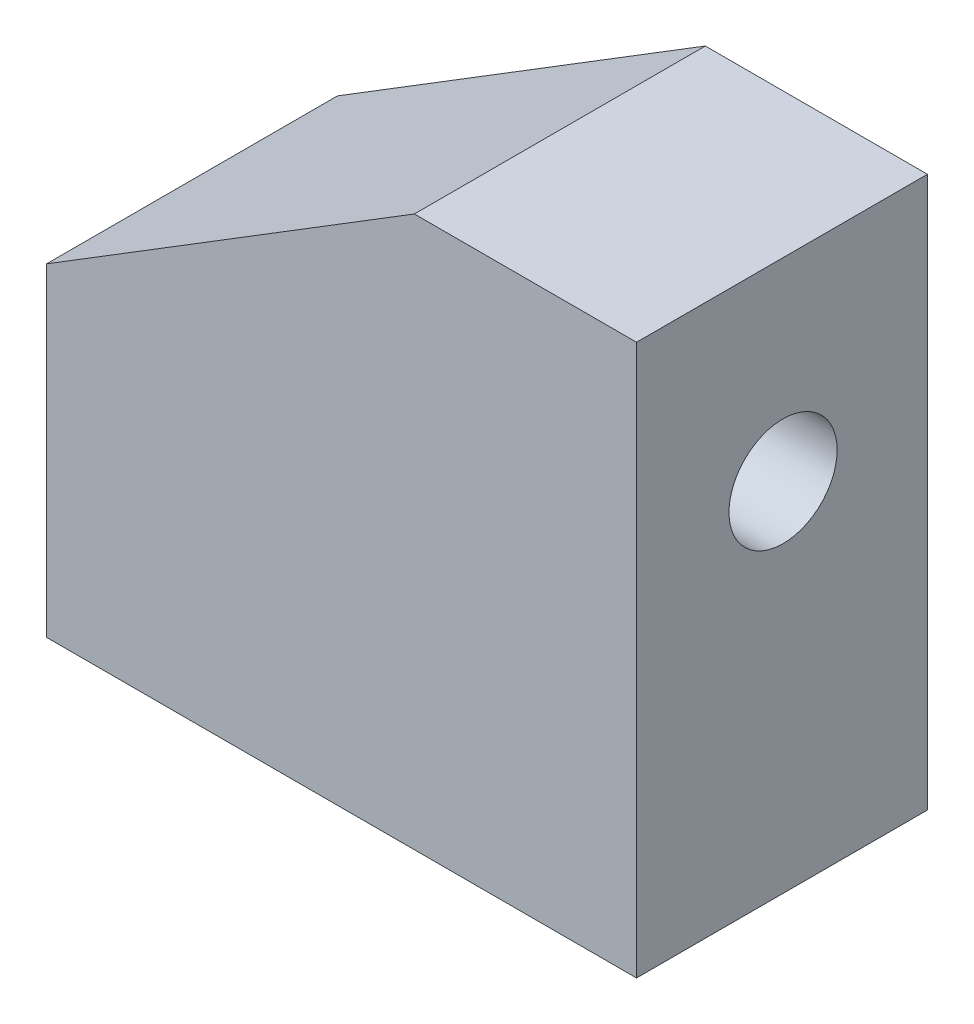
ISO-10303-21;
HEADER;
FILE_DESCRIPTION(('STEP AP214'),'2;1');
FILE_NAME('part.step','',(''),(''),'','','');
FILE_SCHEMA(('AUTOMOTIVE_DESIGN { 1 0 10303 214 1 1 1 1 }'));
ENDSEC;
DATA;
#1=APPLICATION_CONTEXT('core data for automotive mechanical design processes');
#2=APPLICATION_PROTOCOL_DEFINITION('international standard','automotive_design',2000,#1);
#3=PRODUCT_CONTEXT('',#1,'mechanical');
#4=PRODUCT('Part','Part','',(#3));
#5=PRODUCT_RELATED_PRODUCT_CATEGORY('part','',(#4));
#6=PRODUCT_DEFINITION_FORMATION('','',#4);
#7=PRODUCT_DEFINITION_CONTEXT('part definition',#1,'design');
#8=PRODUCT_DEFINITION('design','',#6,#7);
#9=PRODUCT_DEFINITION_SHAPE('','',#8);
#10=(LENGTH_UNIT() NAMED_UNIT(*) SI_UNIT(.MILLI.,.METRE.));
#11=(NAMED_UNIT(*) PLANE_ANGLE_UNIT() SI_UNIT($,.RADIAN.));
#12=(NAMED_UNIT(*) SI_UNIT($,.STERADIAN.) SOLID_ANGLE_UNIT());
#13=UNCERTAINTY_MEASURE_WITH_UNIT(LENGTH_MEASURE(1.E-05),#10,'distance_accuracy_value','');
#14=(GEOMETRIC_REPRESENTATION_CONTEXT(3) GLOBAL_UNCERTAINTY_ASSIGNED_CONTEXT((#13)) GLOBAL_UNIT_ASSIGNED_CONTEXT((#10,
#11,#12)) REPRESENTATION_CONTEXT('',''));
#15=CARTESIAN_POINT('',(0.,0.,0.));
#16=DIRECTION('',(0.,0.,1.));
#17=DIRECTION('',(1.,0.,0.));
#18=AXIS2_PLACEMENT_3D('',#15,#16,#17);
#19=CARTESIAN_POINT('',(0.,47.8103418069486,43.));
#20=DIRECTION('',(1.,0.,0.));
#21=DIRECTION('',(0.,0.,-1.));
#22=AXIS2_PLACEMENT_3D('',#19,#20,#21);
#23=PLANE('',#22);
#24=DIRECTION('',(0.,-1.,0.));
#25=VECTOR('',#24,1.);
#26=CARTESIAN_POINT('',(0.,47.8103418069486,0.));
#27=LINE('',#26,#25);
#28=CARTESIAN_POINT('',(0.,47.8103418069486,0.));
#29=VERTEX_POINT('',#28);
#30=CARTESIAN_POINT('',(0.,0.,0.));
#31=VERTEX_POINT('',#30);
#32=EDGE_CURVE('E109',#29,#31,#27,.T.);
#33=ORIENTED_EDGE('',*,*,#32,.T.);
#34=DIRECTION('',(0.,0.,-1.));
#35=VECTOR('',#34,1.);
#36=CARTESIAN_POINT('',(0.,0.,43.));
#37=LINE('',#36,#35);
#38=CARTESIAN_POINT('',(0.,0.,43.));
#39=VERTEX_POINT('',#38);
#40=EDGE_CURVE('E11',#39,#31,#37,.T.);
#41=ORIENTED_EDGE('',*,*,#40,.F.);
#42=DIRECTION('',(0.,-1.,0.));
#43=VECTOR('',#42,1.);
#44=CARTESIAN_POINT('',(0.,47.8103418069486,43.));
#45=LINE('',#44,#43);
#46=CARTESIAN_POINT('',(0.,47.8103418069486,43.));
#47=VERTEX_POINT('',#46);
#48=EDGE_CURVE('E118',#47,#39,#45,.T.);
#49=ORIENTED_EDGE('',*,*,#48,.F.);
#50=DIRECTION('',(0.,0.,-1.));
#51=VECTOR('',#50,1.);
#52=CARTESIAN_POINT('',(0.,47.8103418069486,43.));
#53=LINE('',#52,#51);
#54=EDGE_CURVE('E105',#47,#29,#53,.T.);
#55=ORIENTED_EDGE('',*,*,#54,.T.);
#56=EDGE_LOOP('',(#33,#41,#49,#55));
#57=FACE_BOUND('',#56,.T.);
#58=ADVANCED_FACE('F35',(#57),#23,.F.);
#59=CARTESIAN_POINT('',(0.,0.,43.));
#60=DIRECTION('',(0.,1.,0.));
#61=DIRECTION('',(0.,0.,1.));
#62=AXIS2_PLACEMENT_3D('',#59,#60,#61);
#63=PLANE('',#62);
#64=DIRECTION('',(1.,0.,0.));
#65=VECTOR('',#64,1.);
#66=CARTESIAN_POINT('',(0.,0.,0.));
#67=LINE('',#66,#65);
#68=CARTESIAN_POINT('',(87.1991799498586,0.,0.));
#69=VERTEX_POINT('',#68);
#70=EDGE_CURVE('E112',#31,#69,#67,.T.);
#71=ORIENTED_EDGE('',*,*,#70,.T.);
#72=DIRECTION('',(0.,0.,-1.));
#73=VECTOR('',#72,1.);
#74=CARTESIAN_POINT('',(87.1991799498586,0.,43.));
#75=LINE('',#74,#73);
#76=CARTESIAN_POINT('',(87.1991799498586,0.,43.));
#77=VERTEX_POINT('',#76);
#78=EDGE_CURVE('E43',#77,#69,#75,.T.);
#79=ORIENTED_EDGE('',*,*,#78,.F.);
#80=DIRECTION('',(1.,0.,0.));
#81=VECTOR('',#80,1.);
#82=CARTESIAN_POINT('',(0.,0.,43.));
#83=LINE('',#82,#81);
#84=EDGE_CURVE('E85',#39,#77,#83,.T.);
#85=ORIENTED_EDGE('',*,*,#84,.F.);
#86=ORIENTED_EDGE('',*,*,#40,.T.);
#87=EDGE_LOOP('',(#71,#79,#85,#86));
#88=FACE_BOUND('',#87,.T.);
#89=ADVANCED_FACE('F137',(#88),#63,.F.);
#90=CARTESIAN_POINT('',(87.1991799498586,0.,43.));
#91=DIRECTION('',(-1.,0.,0.));
#92=DIRECTION('',(0.,0.,1.));
#93=AXIS2_PLACEMENT_3D('',#90,#91,#92);
#94=PLANE('',#93);
#95=CARTESIAN_POINT('',(87.1991799498586,52.756343670034,21.3425845297143));
#96=DIRECTION('',(1.,0.,0.));
#97=DIRECTION('',(0.,0.,-1.));
#98=AXIS2_PLACEMENT_3D('',#95,#96,#97);
#99=CIRCLE('',#98,7.99227003365653);
#100=CARTESIAN_POINT('',(87.1991799498586,52.756343670034,13.3503144960578));
#101=VERTEX_POINT('',#100);
#102=EDGE_CURVE('E150',#101,#101,#99,.T.);
#103=ORIENTED_EDGE('',*,*,#102,.F.);
#104=EDGE_LOOP('',(#103));
#105=FACE_BOUND('',#104,.T.);
#106=DIRECTION('',(0.,1.,0.));
#107=VECTOR('',#106,1.);
#108=CARTESIAN_POINT('',(87.1991799498586,0.,0.));
#109=LINE('',#108,#107);
#110=CARTESIAN_POINT('',(87.1991799498586,81.3756485629323,0.));
#111=VERTEX_POINT('',#110);
#112=EDGE_CURVE('E100',#69,#111,#109,.T.);
#113=ORIENTED_EDGE('',*,*,#112,.T.);
#114=DIRECTION('',(0.,0.,-1.));
#115=VECTOR('',#114,1.);
#116=CARTESIAN_POINT('',(87.1991799498586,81.3756485629323,43.));
#117=LINE('',#116,#115);
#118=CARTESIAN_POINT('',(87.1991799498586,81.3756485629323,43.));
#119=VERTEX_POINT('',#118);
#120=EDGE_CURVE('E97',#119,#111,#117,.T.);
#121=ORIENTED_EDGE('',*,*,#120,.F.);
#122=DIRECTION('',(0.,1.,0.));
#123=VECTOR('',#122,1.);
#124=CARTESIAN_POINT('',(87.1991799498586,0.,43.));
#125=LINE('',#124,#123);
#126=EDGE_CURVE('E89',#77,#119,#125,.T.);
#127=ORIENTED_EDGE('',*,*,#126,.F.);
#128=ORIENTED_EDGE('',*,*,#78,.T.);
#129=EDGE_LOOP('',(#113,#121,#127,#128));
#130=FACE_BOUND('',#129,.T.);
#131=ADVANCED_FACE('F98',(#105,#130),#94,.F.);
#132=CARTESIAN_POINT('',(87.1991799498586,81.3756485629323,43.));
#133=DIRECTION('',(0.,-1.,0.));
#134=DIRECTION('',(0.,0.,-1.));
#135=AXIS2_PLACEMENT_3D('',#132,#133,#134);
#136=PLANE('',#135);
#137=DIRECTION('',(-1.,0.,0.));
#138=VECTOR('',#137,1.);
#139=CARTESIAN_POINT('',(87.1991799498586,81.3756485629323,0.));
#140=LINE('',#139,#138);
#141=CARTESIAN_POINT('',(54.3635537755268,81.3756485629323,0.));
#142=VERTEX_POINT('',#141);
#143=EDGE_CURVE('E71',#111,#142,#140,.T.);
#144=ORIENTED_EDGE('',*,*,#143,.T.);
#145=DIRECTION('',(0.,0.,-1.));
#146=VECTOR('',#145,1.);
#147=CARTESIAN_POINT('',(54.3635537755268,81.3756485629323,43.));
#148=LINE('',#147,#146);
#149=CARTESIAN_POINT('',(54.3635537755268,81.3756485629323,43.));
#150=VERTEX_POINT('',#149);
#151=EDGE_CURVE('E101',#150,#142,#148,.T.);
#152=ORIENTED_EDGE('',*,*,#151,.F.);
#153=DIRECTION('',(-1.,0.,0.));
#154=VECTOR('',#153,1.);
#155=CARTESIAN_POINT('',(87.1991799498586,81.3756485629323,43.));
#156=LINE('',#155,#154);
#157=EDGE_CURVE('E93',#119,#150,#156,.T.);
#158=ORIENTED_EDGE('',*,*,#157,.F.);
#159=ORIENTED_EDGE('',*,*,#120,.T.);
#160=EDGE_LOOP('',(#144,#152,#158,#159));
#161=FACE_BOUND('',#160,.T.);
#162=ADVANCED_FACE('F103',(#161),#136,.F.);
#163=CARTESIAN_POINT('',(54.3635537755268,81.3756485629323,43.));
#164=DIRECTION('',(0.525354852611512,-0.850883234549568,0.));
#165=DIRECTION('',(0.850883234549568,0.525354852611512,0.));
#166=AXIS2_PLACEMENT_3D('',#163,#164,#165);
#167=PLANE('',#166);
#168=DIRECTION('',(-0.850883234549568,-0.525354852611512,0.));
#169=VECTOR('',#168,1.);
#170=CARTESIAN_POINT('',(54.3635537755268,81.3756485629323,0.));
#171=LINE('',#170,#169);
#172=EDGE_CURVE('E77',#142,#29,#171,.T.);
#173=ORIENTED_EDGE('',*,*,#172,.T.);
#174=ORIENTED_EDGE('',*,*,#54,.F.);
#175=DIRECTION('',(-0.850883234549568,-0.525354852611512,0.));
#176=VECTOR('',#175,1.);
#177=CARTESIAN_POINT('',(54.3635537755268,81.3756485629323,43.));
#178=LINE('',#177,#176);
#179=EDGE_CURVE('E51',#150,#47,#178,.T.);
#180=ORIENTED_EDGE('',*,*,#179,.F.);
#181=ORIENTED_EDGE('',*,*,#151,.T.);
#182=EDGE_LOOP('',(#173,#174,#180,#181));
#183=FACE_BOUND('',#182,.T.);
#184=ADVANCED_FACE('F126',(#183),#167,.F.);
#185=CARTESIAN_POINT('',(0.,0.,43.));
#186=DIRECTION('',(0.,0.,1.));
#187=DIRECTION('',(1.,0.,0.));
#188=AXIS2_PLACEMENT_3D('',#185,#186,#187);
#189=PLANE('',#188);
#190=ORIENTED_EDGE('',*,*,#48,.T.);
#191=ORIENTED_EDGE('',*,*,#84,.T.);
#192=ORIENTED_EDGE('',*,*,#126,.T.);
#193=ORIENTED_EDGE('',*,*,#157,.T.);
#194=ORIENTED_EDGE('',*,*,#179,.T.);
#195=EDGE_LOOP('',(#190,#191,#192,#193,#194));
#196=FACE_BOUND('',#195,.T.);
#197=ADVANCED_FACE('F91',(#196),#189,.T.);
#198=CARTESIAN_POINT('',(0.,0.,0.));
#199=DIRECTION('',(0.,0.,1.));
#200=DIRECTION('',(1.,0.,0.));
#201=AXIS2_PLACEMENT_3D('',#198,#199,#200);
#202=PLANE('',#201);
#203=ORIENTED_EDGE('',*,*,#32,.F.);
#204=ORIENTED_EDGE('',*,*,#172,.F.);
#205=ORIENTED_EDGE('',*,*,#143,.F.);
#206=ORIENTED_EDGE('',*,*,#112,.F.);
#207=ORIENTED_EDGE('',*,*,#70,.F.);
#208=EDGE_LOOP('',(#203,#204,#205,#206,#207));
#209=FACE_BOUND('',#208,.T.);
#210=ADVANCED_FACE('F122',(#209),#202,.F.);
#211=CARTESIAN_POINT('',(67.1991799498586,52.756343670034,21.3425845297143));
#212=DIRECTION('',(1.,0.,0.));
#213=DIRECTION('',(0.,0.,-1.));
#214=AXIS2_PLACEMENT_3D('',#211,#212,#213);
#215=CYLINDRICAL_SURFACE('',#214,7.99227003365653);
#216=CARTESIAN_POINT('',(67.1991799498586,52.756343670034,21.3425845297143));
#217=DIRECTION('',(1.,0.,0.));
#218=DIRECTION('',(0.,0.,-1.));
#219=AXIS2_PLACEMENT_3D('',#216,#217,#218);
#220=CIRCLE('',#219,7.99227003365653);
#221=CARTESIAN_POINT('',(67.1991799498586,52.756343670034,13.3503144960578));
#222=VERTEX_POINT('',#221);
#223=EDGE_CURVE('E113',#222,#222,#220,.T.);
#224=ORIENTED_EDGE('',*,*,#223,.F.);
#225=EDGE_LOOP('',(#224));
#226=FACE_BOUND('',#225,.T.);
#227=ORIENTED_EDGE('',*,*,#102,.T.);
#228=EDGE_LOOP('',(#227));
#229=FACE_BOUND('',#228,.T.);
#230=ADVANCED_FACE('F160',(#226,#229),#215,.F.);
#231=CARTESIAN_POINT('',(67.1991799498586,52.756343670034,21.3425845297143));
#232=DIRECTION('',(1.,0.,0.));
#233=DIRECTION('',(0.,0.,-1.));
#234=AXIS2_PLACEMENT_3D('',#231,#232,#233);
#235=PLANE('',#234);
#236=ORIENTED_EDGE('',*,*,#223,.T.);
#237=EDGE_LOOP('',(#236));
#238=FACE_BOUND('',#237,.T.);
#239=ADVANCED_FACE('F158',(#238),#235,.T.);
#240=CLOSED_SHELL('',(#58,#89,#131,#162,#184,#197,#210,#230,#239));
#241=MANIFOLD_SOLID_BREP('B2',#240);
#242=ADVANCED_BREP_SHAPE_REPRESENTATION('',(#18,#241),#14);
#243=SHAPE_DEFINITION_REPRESENTATION(#9,#242);
ENDSEC;
END-ISO-10303-21;
